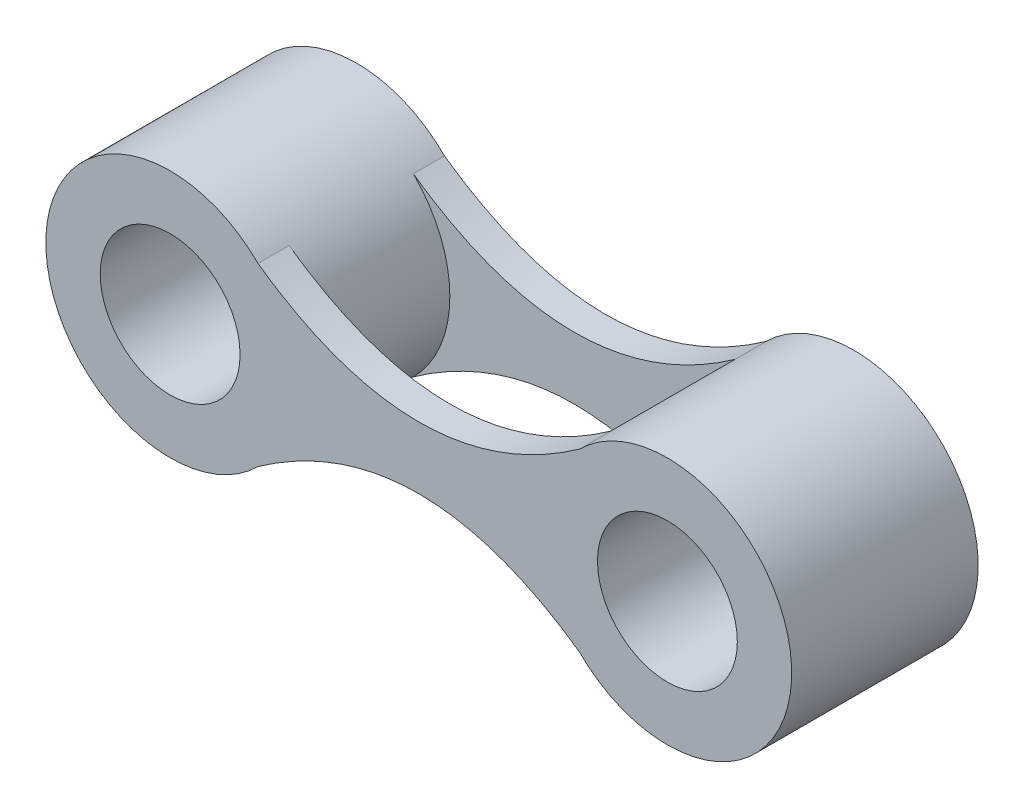
ISO-10303-21;
HEADER;
FILE_DESCRIPTION(('STEP AP214'),'2;1');
FILE_NAME('part.step','',(''),(''),'','','');
FILE_SCHEMA(('AUTOMOTIVE_DESIGN { 1 0 10303 214 1 1 1 1 }'));
ENDSEC;
DATA;
#1=APPLICATION_CONTEXT('core data for automotive mechanical design processes');
#2=APPLICATION_PROTOCOL_DEFINITION('international standard','automotive_design',2000,#1);
#3=PRODUCT_CONTEXT('',#1,'mechanical');
#4=PRODUCT('Part','Part','',(#3));
#5=PRODUCT_RELATED_PRODUCT_CATEGORY('part','',(#4));
#6=PRODUCT_DEFINITION_FORMATION('','',#4);
#7=PRODUCT_DEFINITION_CONTEXT('part definition',#1,'design');
#8=PRODUCT_DEFINITION('design','',#6,#7);
#9=PRODUCT_DEFINITION_SHAPE('','',#8);
#10=(LENGTH_UNIT() NAMED_UNIT(*) SI_UNIT(.MILLI.,.METRE.));
#11=(NAMED_UNIT(*) PLANE_ANGLE_UNIT() SI_UNIT($,.RADIAN.));
#12=(NAMED_UNIT(*) SI_UNIT($,.STERADIAN.) SOLID_ANGLE_UNIT());
#13=UNCERTAINTY_MEASURE_WITH_UNIT(LENGTH_MEASURE(1.E-05),#10,'distance_accuracy_value','');
#14=(GEOMETRIC_REPRESENTATION_CONTEXT(3) GLOBAL_UNCERTAINTY_ASSIGNED_CONTEXT((#13)) GLOBAL_UNIT_ASSIGNED_CONTEXT((#10,
#11,#12)) REPRESENTATION_CONTEXT('',''));
#15=CARTESIAN_POINT('',(0.,0.,0.));
#16=DIRECTION('',(0.,0.,1.));
#17=DIRECTION('',(1.,0.,0.));
#18=AXIS2_PLACEMENT_3D('',#15,#16,#17);
#19=CARTESIAN_POINT('',(4.10493596973271,2.24506403026729,0.79375));
#20=CARTESIAN_POINT('',(0.,-0.657564030267288,0.79375));
#21=CARTESIAN_POINT('',(-4.10493596973271,2.24506403026729,0.79375));
#22=B_SPLINE_CURVE_WITH_KNOTS('',2,(#19,#20,#21),.UNSPECIFIED.,.F.,.F.,(3,3),(0.,1.),.UNSPECIFIED.);
#23=DIRECTION('',(0.,0.,-1.));
#24=VECTOR('',#23,1.);
#25=SURFACE_OF_LINEAR_EXTRUSION('',#22,#24);
#26=CARTESIAN_POINT('',(4.10493596973271,2.24506403026729,0.));
#27=CARTESIAN_POINT('',(0.,-0.657564030267288,0.));
#28=CARTESIAN_POINT('',(-4.10493596973271,2.24506403026729,0.));
#29=B_SPLINE_CURVE_WITH_KNOTS('',2,(#26,#27,#28),.UNSPECIFIED.,.F.,.F.,(3,3),(0.,1.),.UNSPECIFIED.);
#30=CARTESIAN_POINT('',(4.10493596973271,2.24506403026729,0.));
#31=VERTEX_POINT('',#30);
#32=CARTESIAN_POINT('',(-4.10493596973271,2.24506403026729,0.));
#33=VERTEX_POINT('',#32);
#34=EDGE_CURVE('E110',#31,#33,#29,.T.);
#35=ORIENTED_EDGE('',*,*,#34,.T.);
#36=DIRECTION('',(0.,0.,-1.));
#37=VECTOR('',#36,1.);
#38=CARTESIAN_POINT('',(-4.10493596973271,2.24506403026729,0.79375));
#39=LINE('',#38,#37);
#40=CARTESIAN_POINT('',(-4.10493596973271,2.24506403026729,0.79375));
#41=VERTEX_POINT('',#40);
#42=EDGE_CURVE('E46',#41,#33,#39,.T.);
#43=ORIENTED_EDGE('',*,*,#42,.F.);
#44=CARTESIAN_POINT('',(4.10493596973271,2.24506403026729,0.79375));
#45=VERTEX_POINT('',#44);
#46=EDGE_CURVE('E172',#45,#41,#22,.T.);
#47=ORIENTED_EDGE('',*,*,#46,.F.);
#48=DIRECTION('',(0.,0.,-1.));
#49=VECTOR('',#48,1.);
#50=CARTESIAN_POINT('',(4.10493596973271,2.24506403026729,0.79375));
#51=LINE('',#50,#49);
#52=EDGE_CURVE('E171',#45,#31,#51,.T.);
#53=ORIENTED_EDGE('',*,*,#52,.T.);
#54=EDGE_LOOP('',(#35,#43,#47,#53));
#55=FACE_BOUND('',#54,.T.);
#56=ADVANCED_FACE('F37',(#55),#25,.F.);
#57=CARTESIAN_POINT('',(-6.35,0.,0.79375));
#58=DIRECTION('',(0.,0.,-1.));
#59=DIRECTION('',(-1.,0.,0.));
#60=AXIS2_PLACEMENT_3D('',#57,#58,#59);
#61=CYLINDRICAL_SURFACE('',#60,3.175);
#62=CARTESIAN_POINT('',(-6.35,0.,0.));
#63=DIRECTION('',(0.,0.,1.));
#64=DIRECTION('',(1.,0.,0.));
#65=AXIS2_PLACEMENT_3D('',#62,#63,#64);
#66=CIRCLE('',#65,3.175);
#67=CARTESIAN_POINT('',(-4.10493596973271,-2.24506403026729,0.));
#68=VERTEX_POINT('',#67);
#69=EDGE_CURVE('E183',#33,#68,#66,.T.);
#70=ORIENTED_EDGE('',*,*,#69,.T.);
#71=DIRECTION('',(0.,0.,-1.));
#72=VECTOR('',#71,1.);
#73=CARTESIAN_POINT('',(-4.10493596973271,-2.24506403026729,0.79375));
#74=LINE('',#73,#72);
#75=CARTESIAN_POINT('',(-4.10493596973271,-2.24506403026729,0.79375));
#76=VERTEX_POINT('',#75);
#77=EDGE_CURVE('E202',#76,#68,#74,.T.);
#78=ORIENTED_EDGE('',*,*,#77,.F.);
#79=CARTESIAN_POINT('',(-6.35,0.,0.79375));
#80=DIRECTION('',(0.,0.,1.));
#81=DIRECTION('',(1.,0.,0.));
#82=AXIS2_PLACEMENT_3D('',#79,#80,#81);
#83=CIRCLE('',#82,3.175);
#84=EDGE_CURVE('E11',#76,#41,#83,.T.);
#85=ORIENTED_EDGE('',*,*,#84,.T.);
#86=ORIENTED_EDGE('',*,*,#42,.T.);
#87=EDGE_LOOP('',(#70,#78,#85,#86));
#88=FACE_BOUND('',#87,.T.);
#89=CARTESIAN_POINT('',(-6.35,0.,3.96875));
#90=DIRECTION('',(0.,0.,1.));
#91=DIRECTION('',(1.,0.,0.));
#92=AXIS2_PLACEMENT_3D('',#89,#90,#91);
#93=CIRCLE('',#92,3.175);
#94=CARTESIAN_POINT('',(-4.10493596973271,-2.24506403026729,3.96875));
#95=VERTEX_POINT('',#94);
#96=CARTESIAN_POINT('',(-4.10493596973271,2.24506403026729,3.96875));
#97=VERTEX_POINT('',#96);
#98=EDGE_CURVE('E54',#95,#97,#93,.T.);
#99=ORIENTED_EDGE('',*,*,#98,.F.);
#100=DIRECTION('',(0.,0.,1.));
#101=VECTOR('',#100,1.);
#102=CARTESIAN_POINT('',(-4.10493596973271,-2.24506403026729,3.96875));
#103=LINE('',#102,#101);
#104=CARTESIAN_POINT('',(-4.10493596973271,-2.24506403026729,4.7625));
#105=VERTEX_POINT('',#104);
#106=EDGE_CURVE('E329',#95,#105,#103,.T.);
#107=ORIENTED_EDGE('',*,*,#106,.T.);
#108=CARTESIAN_POINT('',(-6.35,0.,4.7625));
#109=DIRECTION('',(0.,0.,1.));
#110=DIRECTION('',(1.,0.,0.));
#111=AXIS2_PLACEMENT_3D('',#108,#109,#110);
#112=CIRCLE('',#111,3.175);
#113=CARTESIAN_POINT('',(-4.10493596973271,2.24506403026729,4.7625));
#114=VERTEX_POINT('',#113);
#115=EDGE_CURVE('E123',#114,#105,#112,.T.);
#116=ORIENTED_EDGE('',*,*,#115,.F.);
#117=DIRECTION('',(0.,0.,1.));
#118=VECTOR('',#117,1.);
#119=CARTESIAN_POINT('',(-4.10493596973271,2.24506403026729,3.96875));
#120=LINE('',#119,#118);
#121=EDGE_CURVE('E125',#97,#114,#120,.T.);
#122=ORIENTED_EDGE('',*,*,#121,.F.);
#123=EDGE_LOOP('',(#99,#107,#116,#122));
#124=FACE_BOUND('',#123,.T.);
#125=ADVANCED_FACE('F163',(#88,#124),#61,.T.);
#126=CARTESIAN_POINT('',(-4.10493596973271,-2.24506403026729,0.79375));
#127=CARTESIAN_POINT('',(0.,0.657564030267288,0.79375));
#128=CARTESIAN_POINT('',(4.10493596973271,-2.24506403026729,0.79375));
#129=B_SPLINE_CURVE_WITH_KNOTS('',2,(#126,#127,#128),.UNSPECIFIED.,.F.,.F.,(3,3),(0.,1.),.UNSPECIFIED.);
#130=DIRECTION('',(0.,0.,-1.));
#131=VECTOR('',#130,1.);
#132=SURFACE_OF_LINEAR_EXTRUSION('',#129,#131);
#133=CARTESIAN_POINT('',(-4.10493596973271,-2.24506403026729,0.));
#134=CARTESIAN_POINT('',(0.,0.657564030267288,0.));
#135=CARTESIAN_POINT('',(4.10493596973271,-2.24506403026729,0.));
#136=B_SPLINE_CURVE_WITH_KNOTS('',2,(#133,#134,#135),.UNSPECIFIED.,.F.,.F.,(3,3),(0.,1.),.UNSPECIFIED.);
#137=CARTESIAN_POINT('',(4.10493596973271,-2.24506403026729,0.));
#138=VERTEX_POINT('',#137);
#139=EDGE_CURVE('E188',#68,#138,#136,.T.);
#140=ORIENTED_EDGE('',*,*,#139,.T.);
#141=DIRECTION('',(0.,0.,-1.));
#142=VECTOR('',#141,1.);
#143=CARTESIAN_POINT('',(4.10493596973271,-2.24506403026729,0.79375));
#144=LINE('',#143,#142);
#145=CARTESIAN_POINT('',(4.10493596973271,-2.24506403026729,0.79375));
#146=VERTEX_POINT('',#145);
#147=EDGE_CURVE('E199',#146,#138,#144,.T.);
#148=ORIENTED_EDGE('',*,*,#147,.F.);
#149=EDGE_CURVE('E165',#76,#146,#129,.T.);
#150=ORIENTED_EDGE('',*,*,#149,.F.);
#151=ORIENTED_EDGE('',*,*,#77,.T.);
#152=EDGE_LOOP('',(#140,#148,#150,#151));
#153=FACE_BOUND('',#152,.T.);
#154=ADVANCED_FACE('F159',(#153),#132,.F.);
#155=CARTESIAN_POINT('',(6.35,0.,0.79375));
#156=DIRECTION('',(0.,0.,-1.));
#157=DIRECTION('',(-1.,0.,0.));
#158=AXIS2_PLACEMENT_3D('',#155,#156,#157);
#159=CYLINDRICAL_SURFACE('',#158,3.175);
#160=CARTESIAN_POINT('',(6.35,0.,0.));
#161=DIRECTION('',(0.,0.,1.));
#162=DIRECTION('',(1.,0.,0.));
#163=AXIS2_PLACEMENT_3D('',#160,#161,#162);
#164=CIRCLE('',#163,3.175);
#165=EDGE_CURVE('E192',#138,#31,#164,.T.);
#166=ORIENTED_EDGE('',*,*,#165,.T.);
#167=ORIENTED_EDGE('',*,*,#52,.F.);
#168=CARTESIAN_POINT('',(6.34999999999999,0.,0.79375));
#169=DIRECTION('',(0.,0.,1.));
#170=DIRECTION('',(1.,0.,0.));
#171=AXIS2_PLACEMENT_3D('',#168,#169,#170);
#172=CIRCLE('',#171,3.175);
#173=EDGE_CURVE('E111',#45,#146,#172,.T.);
#174=ORIENTED_EDGE('',*,*,#173,.T.);
#175=ORIENTED_EDGE('',*,*,#147,.T.);
#176=EDGE_LOOP('',(#166,#167,#174,#175));
#177=FACE_BOUND('',#176,.T.);
#178=CARTESIAN_POINT('',(6.34999999999999,0.,3.96875));
#179=DIRECTION('',(0.,0.,1.));
#180=DIRECTION('',(1.,0.,0.));
#181=AXIS2_PLACEMENT_3D('',#178,#179,#180);
#182=CIRCLE('',#181,3.175);
#183=CARTESIAN_POINT('',(4.10493596973271,2.24506403026729,3.96875));
#184=VERTEX_POINT('',#183);
#185=CARTESIAN_POINT('',(4.10493596973271,-2.24506403026729,3.96875));
#186=VERTEX_POINT('',#185);
#187=EDGE_CURVE('E62',#184,#186,#182,.T.);
#188=ORIENTED_EDGE('',*,*,#187,.F.);
#189=DIRECTION('',(0.,0.,1.));
#190=VECTOR('',#189,1.);
#191=CARTESIAN_POINT('',(4.10493596973271,2.24506403026729,3.96875));
#192=LINE('',#191,#190);
#193=CARTESIAN_POINT('',(4.10493596973271,2.24506403026729,4.7625));
#194=VERTEX_POINT('',#193);
#195=EDGE_CURVE('E106',#184,#194,#192,.T.);
#196=ORIENTED_EDGE('',*,*,#195,.T.);
#197=CARTESIAN_POINT('',(6.35,0.,4.7625));
#198=DIRECTION('',(0.,0.,1.));
#199=DIRECTION('',(1.,0.,0.));
#200=AXIS2_PLACEMENT_3D('',#197,#198,#199);
#201=CIRCLE('',#200,3.175);
#202=CARTESIAN_POINT('',(4.10493596973271,-2.24506403026729,4.7625));
#203=VERTEX_POINT('',#202);
#204=EDGE_CURVE('E328',#203,#194,#201,.T.);
#205=ORIENTED_EDGE('',*,*,#204,.F.);
#206=DIRECTION('',(0.,0.,1.));
#207=VECTOR('',#206,1.);
#208=CARTESIAN_POINT('',(4.10493596973271,-2.24506403026729,3.96875));
#209=LINE('',#208,#207);
#210=EDGE_CURVE('E108',#186,#203,#209,.T.);
#211=ORIENTED_EDGE('',*,*,#210,.F.);
#212=EDGE_LOOP('',(#188,#196,#205,#211));
#213=FACE_BOUND('',#212,.T.);
#214=ADVANCED_FACE('F104',(#177,#213),#159,.T.);
#215=CARTESIAN_POINT('',(0.,0.79375,0.79375));
#216=DIRECTION('',(0.,0.,-1.));
#217=DIRECTION('',(-1.,0.,0.));
#218=AXIS2_PLACEMENT_3D('',#215,#216,#217);
#219=PLANE('',#218);
#220=ORIENTED_EDGE('',*,*,#173,.F.);
#221=ORIENTED_EDGE('',*,*,#46,.T.);
#222=ORIENTED_EDGE('',*,*,#84,.F.);
#223=ORIENTED_EDGE('',*,*,#149,.T.);
#224=EDGE_LOOP('',(#220,#221,#222,#223));
#225=FACE_BOUND('',#224,.T.);
#226=ADVANCED_FACE('F149',(#225),#219,.F.);
#227=CARTESIAN_POINT('',(0.,0.79375,0.));
#228=DIRECTION('',(0.,0.,-1.));
#229=DIRECTION('',(-1.,0.,0.));
#230=AXIS2_PLACEMENT_3D('',#227,#228,#229);
#231=PLANE('',#230);
#232=CARTESIAN_POINT('',(6.34999999999999,0.,0.));
#233=DIRECTION('',(0.,0.,-1.));
#234=DIRECTION('',(-1.,0.,0.));
#235=AXIS2_PLACEMENT_3D('',#232,#233,#234);
#236=CIRCLE('',#235,1.7859375);
#237=CARTESIAN_POINT('',(4.56406249999999,0.,0.));
#238=VERTEX_POINT('',#237);
#239=EDGE_CURVE('E208',#238,#238,#236,.T.);
#240=ORIENTED_EDGE('',*,*,#239,.F.);
#241=EDGE_LOOP('',(#240));
#242=FACE_BOUND('',#241,.T.);
#243=CARTESIAN_POINT('',(-6.35,0.,0.));
#244=DIRECTION('',(0.,0.,-1.));
#245=DIRECTION('',(-1.,0.,0.));
#246=AXIS2_PLACEMENT_3D('',#243,#244,#245);
#247=CIRCLE('',#246,1.7859375);
#248=CARTESIAN_POINT('',(-8.1359375,0.,0.));
#249=VERTEX_POINT('',#248);
#250=EDGE_CURVE('E134',#249,#249,#247,.T.);
#251=ORIENTED_EDGE('',*,*,#250,.F.);
#252=EDGE_LOOP('',(#251));
#253=FACE_BOUND('',#252,.T.);
#254=ORIENTED_EDGE('',*,*,#34,.F.);
#255=ORIENTED_EDGE('',*,*,#165,.F.);
#256=ORIENTED_EDGE('',*,*,#139,.F.);
#257=ORIENTED_EDGE('',*,*,#69,.F.);
#258=EDGE_LOOP('',(#254,#255,#256,#257));
#259=FACE_BOUND('',#258,.T.);
#260=ADVANCED_FACE('F152',(#242,#253,#259),#231,.T.);
#261=CARTESIAN_POINT('',(0.,0.79375,3.96875));
#262=DIRECTION('',(0.,0.,1.));
#263=DIRECTION('',(-1.,0.,0.));
#264=AXIS2_PLACEMENT_3D('',#261,#262,#263);
#265=PLANE('',#264);
#266=CARTESIAN_POINT('',(-4.10493596973271,-2.24506403026729,3.96875));
#267=CARTESIAN_POINT('',(0.,0.657564030267288,3.96875));
#268=CARTESIAN_POINT('',(4.10493596973271,-2.24506403026729,3.96875));
#269=B_SPLINE_CURVE_WITH_KNOTS('',2,(#266,#267,#268),.UNSPECIFIED.,.F.,.F.,(3,3),(0.,1.),.UNSPECIFIED.);
#270=EDGE_CURVE('E122',#95,#186,#269,.T.);
#271=ORIENTED_EDGE('',*,*,#270,.F.);
#272=ORIENTED_EDGE('',*,*,#98,.T.);
#273=CARTESIAN_POINT('',(4.10493596973271,2.24506403026729,3.96875));
#274=CARTESIAN_POINT('',(0.,-0.657564030267288,3.96875));
#275=CARTESIAN_POINT('',(-4.10493596973271,2.24506403026729,3.96875));
#276=B_SPLINE_CURVE_WITH_KNOTS('',2,(#273,#274,#275),.UNSPECIFIED.,.F.,.F.,(3,3),(0.,1.),.UNSPECIFIED.);
#277=EDGE_CURVE('E116',#184,#97,#276,.T.);
#278=ORIENTED_EDGE('',*,*,#277,.F.);
#279=ORIENTED_EDGE('',*,*,#187,.T.);
#280=EDGE_LOOP('',(#271,#272,#278,#279));
#281=FACE_BOUND('',#280,.T.);
#282=ADVANCED_FACE('F121',(#281),#265,.F.);
#283=DIRECTION('',(0.,0.,1.));
#284=VECTOR('',#283,1.);
#285=SURFACE_OF_LINEAR_EXTRUSION('',#276,#284);
#286=CARTESIAN_POINT('',(4.10493596973271,2.24506403026729,4.7625));
#287=CARTESIAN_POINT('',(0.,-0.657564030267288,4.7625));
#288=CARTESIAN_POINT('',(-4.10493596973271,2.24506403026729,4.7625));
#289=B_SPLINE_CURVE_WITH_KNOTS('',2,(#286,#287,#288),.UNSPECIFIED.,.F.,.F.,(3,3),(0.,1.),.UNSPECIFIED.);
#290=EDGE_CURVE('E118',#194,#114,#289,.T.);
#291=ORIENTED_EDGE('',*,*,#290,.F.);
#292=ORIENTED_EDGE('',*,*,#195,.F.);
#293=ORIENTED_EDGE('',*,*,#277,.T.);
#294=ORIENTED_EDGE('',*,*,#121,.T.);
#295=EDGE_LOOP('',(#291,#292,#293,#294));
#296=FACE_BOUND('',#295,.T.);
#297=ADVANCED_FACE('F115',(#296),#285,.T.);
#298=DIRECTION('',(0.,0.,1.));
#299=VECTOR('',#298,1.);
#300=SURFACE_OF_LINEAR_EXTRUSION('',#269,#299);
#301=CARTESIAN_POINT('',(-4.10493596973271,-2.24506403026729,4.7625));
#302=CARTESIAN_POINT('',(0.,0.657564030267288,4.7625));
#303=CARTESIAN_POINT('',(4.10493596973271,-2.24506403026729,4.7625));
#304=B_SPLINE_CURVE_WITH_KNOTS('',2,(#301,#302,#303),.UNSPECIFIED.,.F.,.F.,(3,3),(0.,1.),.UNSPECIFIED.);
#305=EDGE_CURVE('E128',#105,#203,#304,.T.);
#306=ORIENTED_EDGE('',*,*,#305,.F.);
#307=ORIENTED_EDGE('',*,*,#106,.F.);
#308=ORIENTED_EDGE('',*,*,#270,.T.);
#309=ORIENTED_EDGE('',*,*,#210,.T.);
#310=EDGE_LOOP('',(#306,#307,#308,#309));
#311=FACE_BOUND('',#310,.T.);
#312=ADVANCED_FACE('F147',(#311),#300,.T.);
#313=CARTESIAN_POINT('',(0.,0.79375,4.7625));
#314=DIRECTION('',(0.,0.,1.));
#315=DIRECTION('',(-1.,0.,0.));
#316=AXIS2_PLACEMENT_3D('',#313,#314,#315);
#317=PLANE('',#316);
#318=CARTESIAN_POINT('',(6.34999999999999,0.,4.7625));
#319=DIRECTION('',(0.,0.,1.));
#320=DIRECTION('',(1.,0.,0.));
#321=AXIS2_PLACEMENT_3D('',#318,#319,#320);
#322=CIRCLE('',#321,1.7859375);
#323=CARTESIAN_POINT('',(8.1359375,0.,4.7625));
#324=VERTEX_POINT('',#323);
#325=EDGE_CURVE('E41',#324,#324,#322,.T.);
#326=ORIENTED_EDGE('',*,*,#325,.F.);
#327=EDGE_LOOP('',(#326));
#328=FACE_BOUND('',#327,.T.);
#329=CARTESIAN_POINT('',(-6.35,0.,4.7625));
#330=DIRECTION('',(0.,0.,1.));
#331=DIRECTION('',(1.,0.,0.));
#332=AXIS2_PLACEMENT_3D('',#329,#330,#331);
#333=CIRCLE('',#332,1.7859375);
#334=CARTESIAN_POINT('',(-4.5640625,0.,4.7625));
#335=VERTEX_POINT('',#334);
#336=EDGE_CURVE('E206',#335,#335,#333,.T.);
#337=ORIENTED_EDGE('',*,*,#336,.F.);
#338=EDGE_LOOP('',(#337));
#339=FACE_BOUND('',#338,.T.);
#340=ORIENTED_EDGE('',*,*,#290,.T.);
#341=ORIENTED_EDGE('',*,*,#115,.T.);
#342=ORIENTED_EDGE('',*,*,#305,.T.);
#343=ORIENTED_EDGE('',*,*,#204,.T.);
#344=EDGE_LOOP('',(#340,#341,#342,#343));
#345=FACE_BOUND('',#344,.T.);
#346=ADVANCED_FACE('F288',(#328,#339,#345),#317,.T.);
#347=CARTESIAN_POINT('',(-6.35,0.,6.35));
#348=DIRECTION('',(0.,0.,-1.));
#349=DIRECTION('',(-1.,0.,0.));
#350=AXIS2_PLACEMENT_3D('',#347,#348,#349);
#351=CYLINDRICAL_SURFACE('',#350,1.7859375);
#352=ORIENTED_EDGE('',*,*,#336,.T.);
#353=EDGE_LOOP('',(#352));
#354=FACE_BOUND('',#353,.T.);
#355=ORIENTED_EDGE('',*,*,#250,.T.);
#356=EDGE_LOOP('',(#355));
#357=FACE_BOUND('',#356,.T.);
#358=ADVANCED_FACE('F218',(#354,#357),#351,.F.);
#359=CARTESIAN_POINT('',(6.34999999999999,0.,6.35));
#360=DIRECTION('',(0.,0.,-1.));
#361=DIRECTION('',(-1.,0.,0.));
#362=AXIS2_PLACEMENT_3D('',#359,#360,#361);
#363=CYLINDRICAL_SURFACE('',#362,1.7859375);
#364=ORIENTED_EDGE('',*,*,#325,.T.);
#365=EDGE_LOOP('',(#364));
#366=FACE_BOUND('',#365,.T.);
#367=ORIENTED_EDGE('',*,*,#239,.T.);
#368=EDGE_LOOP('',(#367));
#369=FACE_BOUND('',#368,.T.);
#370=ADVANCED_FACE('F310',(#366,#369),#363,.F.);
#371=CLOSED_SHELL('',(#56,#125,#154,#214,#226,#260,#282,#297,#312,#346,#358,#370));
#372=MANIFOLD_SOLID_BREP('B2',#371);
#373=ADVANCED_BREP_SHAPE_REPRESENTATION('',(#18,#372),#14);
#374=SHAPE_DEFINITION_REPRESENTATION(#9,#373);
ENDSEC;
END-ISO-10303-21;
